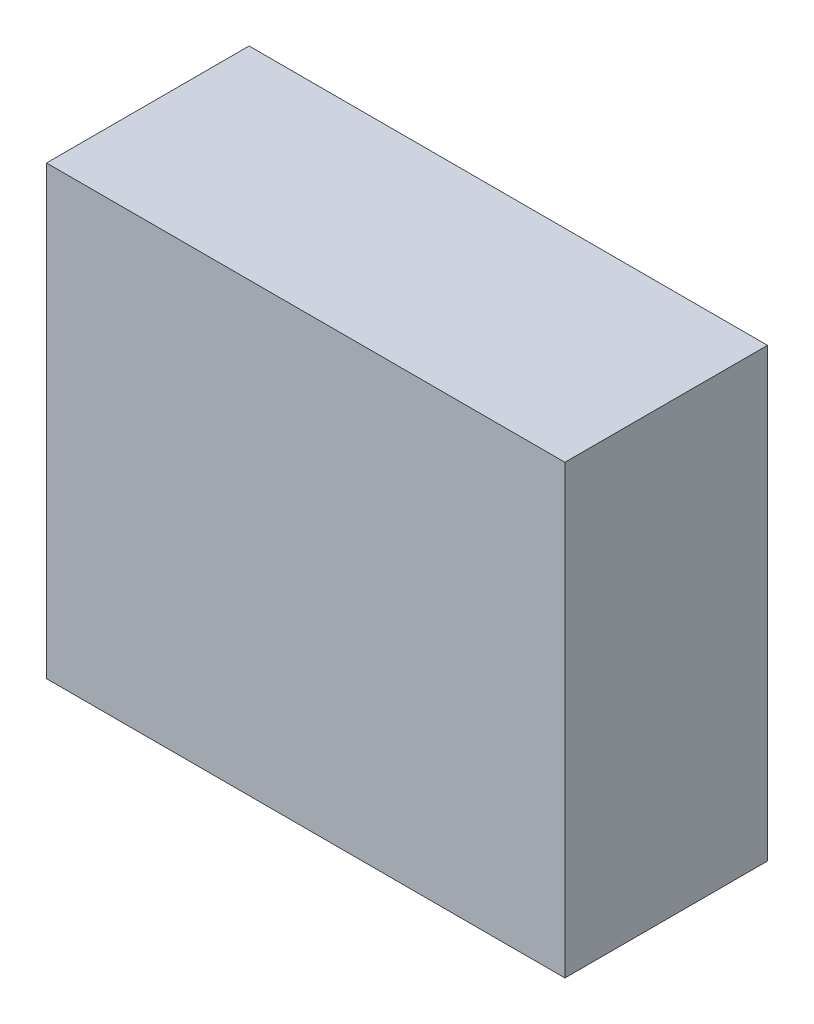
ISO-10303-21;
HEADER;
FILE_DESCRIPTION(('STEP AP214'),'2;1');
FILE_NAME('part.step','',(''),(''),'','','');
FILE_SCHEMA(('AUTOMOTIVE_DESIGN { 1 0 10303 214 1 1 1 1 }'));
ENDSEC;
DATA;
#1=APPLICATION_CONTEXT('core data for automotive mechanical design processes');
#2=APPLICATION_PROTOCOL_DEFINITION('international standard','automotive_design',2000,#1);
#3=PRODUCT_CONTEXT('',#1,'mechanical');
#4=PRODUCT('Part','Part','',(#3));
#5=PRODUCT_RELATED_PRODUCT_CATEGORY('part','',(#4));
#6=PRODUCT_DEFINITION_FORMATION('','',#4);
#7=PRODUCT_DEFINITION_CONTEXT('part definition',#1,'design');
#8=PRODUCT_DEFINITION('design','',#6,#7);
#9=PRODUCT_DEFINITION_SHAPE('','',#8);
#10=(LENGTH_UNIT() NAMED_UNIT(*) SI_UNIT(.MILLI.,.METRE.));
#11=(NAMED_UNIT(*) PLANE_ANGLE_UNIT() SI_UNIT($,.RADIAN.));
#12=(NAMED_UNIT(*) SI_UNIT($,.STERADIAN.) SOLID_ANGLE_UNIT());
#13=UNCERTAINTY_MEASURE_WITH_UNIT(LENGTH_MEASURE(1.E-05),#10,'distance_accuracy_value','');
#14=(GEOMETRIC_REPRESENTATION_CONTEXT(3) GLOBAL_UNCERTAINTY_ASSIGNED_CONTEXT((#13)) GLOBAL_UNIT_ASSIGNED_CONTEXT((#10,
#11,#12)) REPRESENTATION_CONTEXT('',''));
#15=CARTESIAN_POINT('',(0.,0.,0.));
#16=DIRECTION('',(0.,0.,1.));
#17=DIRECTION('',(1.,0.,0.));
#18=AXIS2_PLACEMENT_3D('',#15,#16,#17);
#19=CARTESIAN_POINT('',(32.5,28.,25.4));
#20=DIRECTION('',(-1.,0.,0.));
#21=DIRECTION('',(0.,-1.,0.));
#22=AXIS2_PLACEMENT_3D('',#19,#20,#21);
#23=PLANE('',#22);
#24=DIRECTION('',(0.,1.,0.));
#25=VECTOR('',#24,1.);
#26=CARTESIAN_POINT('',(32.5,28.,0.));
#27=LINE('',#26,#25);
#28=CARTESIAN_POINT('',(32.5,-28.,0.));
#29=VERTEX_POINT('',#28);
#30=CARTESIAN_POINT('',(32.5,28.,0.));
#31=VERTEX_POINT('',#30);
#32=EDGE_CURVE('E101',#29,#31,#27,.T.);
#33=ORIENTED_EDGE('',*,*,#32,.T.);
#34=DIRECTION('',(0.,0.,-1.));
#35=VECTOR('',#34,1.);
#36=CARTESIAN_POINT('',(32.5,28.,25.4));
#37=LINE('',#36,#35);
#38=CARTESIAN_POINT('',(32.5,28.,25.4));
#39=VERTEX_POINT('',#38);
#40=EDGE_CURVE('E11',#39,#31,#37,.T.);
#41=ORIENTED_EDGE('',*,*,#40,.F.);
#42=DIRECTION('',(0.,1.,0.));
#43=VECTOR('',#42,1.);
#44=CARTESIAN_POINT('',(32.5,28.,25.4));
#45=LINE('',#44,#43);
#46=CARTESIAN_POINT('',(32.5,-28.,25.4));
#47=VERTEX_POINT('',#46);
#48=EDGE_CURVE('E89',#47,#39,#45,.T.);
#49=ORIENTED_EDGE('',*,*,#48,.F.);
#50=DIRECTION('',(0.,0.,-1.));
#51=VECTOR('',#50,1.);
#52=CARTESIAN_POINT('',(32.5,-28.,25.4));
#53=LINE('',#52,#51);
#54=EDGE_CURVE('E97',#47,#29,#53,.T.);
#55=ORIENTED_EDGE('',*,*,#54,.T.);
#56=EDGE_LOOP('',(#33,#41,#49,#55));
#57=FACE_BOUND('',#56,.T.);
#58=ADVANCED_FACE('F38',(#57),#23,.F.);
#59=CARTESIAN_POINT('',(-32.5,28.,25.4));
#60=DIRECTION('',(0.,-1.,0.));
#61=DIRECTION('',(0.,0.,-1.));
#62=AXIS2_PLACEMENT_3D('',#59,#60,#61);
#63=PLANE('',#62);
#64=DIRECTION('',(-1.,0.,0.));
#65=VECTOR('',#64,1.);
#66=CARTESIAN_POINT('',(-32.5,28.,0.));
#67=LINE('',#66,#65);
#68=CARTESIAN_POINT('',(-32.5,28.,0.));
#69=VERTEX_POINT('',#68);
#70=EDGE_CURVE('E93',#31,#69,#67,.T.);
#71=ORIENTED_EDGE('',*,*,#70,.T.);
#72=DIRECTION('',(0.,0.,-1.));
#73=VECTOR('',#72,1.);
#74=CARTESIAN_POINT('',(-32.5,28.,25.4));
#75=LINE('',#74,#73);
#76=CARTESIAN_POINT('',(-32.5,28.,25.4));
#77=VERTEX_POINT('',#76);
#78=EDGE_CURVE('E46',#77,#69,#75,.T.);
#79=ORIENTED_EDGE('',*,*,#78,.F.);
#80=DIRECTION('',(-1.,0.,0.));
#81=VECTOR('',#80,1.);
#82=CARTESIAN_POINT('',(-32.5,28.,25.4));
#83=LINE('',#82,#81);
#84=EDGE_CURVE('E84',#39,#77,#83,.T.);
#85=ORIENTED_EDGE('',*,*,#84,.F.);
#86=ORIENTED_EDGE('',*,*,#40,.T.);
#87=EDGE_LOOP('',(#71,#79,#85,#86));
#88=FACE_BOUND('',#87,.T.);
#89=ADVANCED_FACE('F92',(#88),#63,.F.);
#90=CARTESIAN_POINT('',(-32.5,28.,25.4));
#91=DIRECTION('',(1.,0.,0.));
#92=DIRECTION('',(0.,1.,0.));
#93=AXIS2_PLACEMENT_3D('',#90,#91,#92);
#94=PLANE('',#93);
#95=DIRECTION('',(0.,-1.,0.));
#96=VECTOR('',#95,1.);
#97=CARTESIAN_POINT('',(-32.5,28.,0.));
#98=LINE('',#97,#96);
#99=CARTESIAN_POINT('',(-32.5,-28.,0.));
#100=VERTEX_POINT('',#99);
#101=EDGE_CURVE('E71',#69,#100,#98,.T.);
#102=ORIENTED_EDGE('',*,*,#101,.T.);
#103=DIRECTION('',(0.,0.,-1.));
#104=VECTOR('',#103,1.);
#105=CARTESIAN_POINT('',(-32.5,-28.,25.4));
#106=LINE('',#105,#104);
#107=CARTESIAN_POINT('',(-32.5,-28.,25.4));
#108=VERTEX_POINT('',#107);
#109=EDGE_CURVE('E94',#108,#100,#106,.T.);
#110=ORIENTED_EDGE('',*,*,#109,.F.);
#111=DIRECTION('',(0.,-1.,0.));
#112=VECTOR('',#111,1.);
#113=CARTESIAN_POINT('',(-32.5,28.,25.4));
#114=LINE('',#113,#112);
#115=EDGE_CURVE('E87',#77,#108,#114,.T.);
#116=ORIENTED_EDGE('',*,*,#115,.F.);
#117=ORIENTED_EDGE('',*,*,#78,.T.);
#118=EDGE_LOOP('',(#102,#110,#116,#117));
#119=FACE_BOUND('',#118,.T.);
#120=ADVANCED_FACE('F95',(#119),#94,.F.);
#121=CARTESIAN_POINT('',(-32.5,-28.,25.4));
#122=DIRECTION('',(0.,1.,0.));
#123=DIRECTION('',(0.,0.,1.));
#124=AXIS2_PLACEMENT_3D('',#121,#122,#123);
#125=PLANE('',#124);
#126=DIRECTION('',(1.,0.,0.));
#127=VECTOR('',#126,1.);
#128=CARTESIAN_POINT('',(-32.5,-28.,0.));
#129=LINE('',#128,#127);
#130=EDGE_CURVE('E77',#100,#29,#129,.T.);
#131=ORIENTED_EDGE('',*,*,#130,.T.);
#132=ORIENTED_EDGE('',*,*,#54,.F.);
#133=DIRECTION('',(1.,0.,0.));
#134=VECTOR('',#133,1.);
#135=CARTESIAN_POINT('',(-32.5,-28.,25.4));
#136=LINE('',#135,#134);
#137=EDGE_CURVE('E54',#108,#47,#136,.T.);
#138=ORIENTED_EDGE('',*,*,#137,.F.);
#139=ORIENTED_EDGE('',*,*,#109,.T.);
#140=EDGE_LOOP('',(#131,#132,#138,#139));
#141=FACE_BOUND('',#140,.T.);
#142=ADVANCED_FACE('F108',(#141),#125,.F.);
#143=CARTESIAN_POINT('',(0.,0.,25.4));
#144=DIRECTION('',(0.,0.,1.));
#145=DIRECTION('',(1.,0.,0.));
#146=AXIS2_PLACEMENT_3D('',#143,#144,#145);
#147=PLANE('',#146);
#148=ORIENTED_EDGE('',*,*,#48,.T.);
#149=ORIENTED_EDGE('',*,*,#84,.T.);
#150=ORIENTED_EDGE('',*,*,#115,.T.);
#151=ORIENTED_EDGE('',*,*,#137,.T.);
#152=EDGE_LOOP('',(#148,#149,#150,#151));
#153=FACE_BOUND('',#152,.T.);
#154=ADVANCED_FACE('F85',(#153),#147,.T.);
#155=CARTESIAN_POINT('',(0.,0.,0.));
#156=DIRECTION('',(0.,0.,1.));
#157=DIRECTION('',(1.,0.,0.));
#158=AXIS2_PLACEMENT_3D('',#155,#156,#157);
#159=PLANE('',#158);
#160=ORIENTED_EDGE('',*,*,#32,.F.);
#161=ORIENTED_EDGE('',*,*,#130,.F.);
#162=ORIENTED_EDGE('',*,*,#101,.F.);
#163=ORIENTED_EDGE('',*,*,#70,.F.);
#164=EDGE_LOOP('',(#160,#161,#162,#163));
#165=FACE_BOUND('',#164,.T.);
#166=ADVANCED_FACE('F111',(#165),#159,.F.);
#167=CLOSED_SHELL('',(#58,#89,#120,#142,#154,#166));
#168=MANIFOLD_SOLID_BREP('B2',#167);
#169=ADVANCED_BREP_SHAPE_REPRESENTATION('',(#18,#168),#14);
#170=SHAPE_DEFINITION_REPRESENTATION(#9,#169);
ENDSEC;
END-ISO-10303-21;
